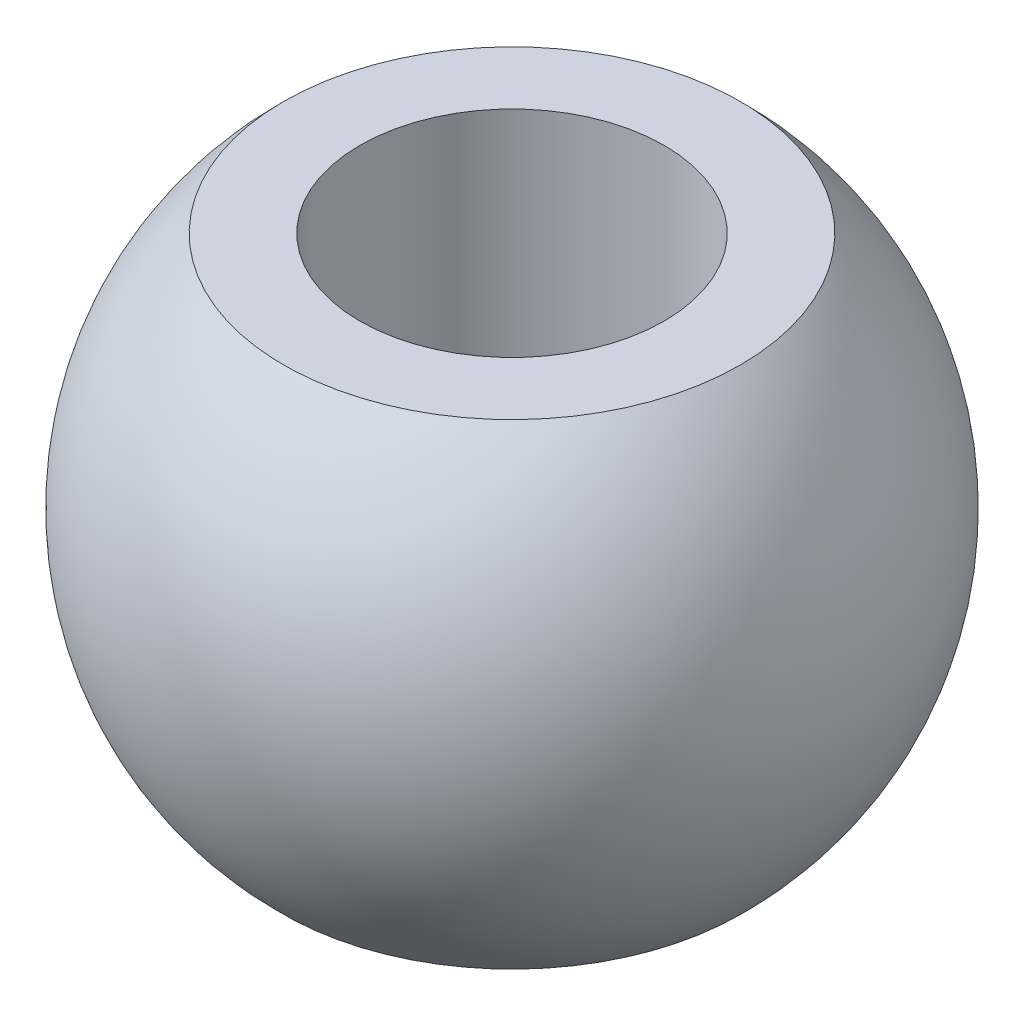
ISO-10303-21;
HEADER;
FILE_DESCRIPTION(('STEP AP214'),'2;1');
FILE_NAME('part.step','',(''),(''),'','','');
FILE_SCHEMA(('AUTOMOTIVE_DESIGN { 1 0 10303 214 1 1 1 1 }'));
ENDSEC;
DATA;
#1=APPLICATION_CONTEXT('core data for automotive mechanical design processes');
#2=APPLICATION_PROTOCOL_DEFINITION('international standard','automotive_design',2000,#1);
#3=PRODUCT_CONTEXT('',#1,'mechanical');
#4=PRODUCT('Part','Part','',(#3));
#5=PRODUCT_RELATED_PRODUCT_CATEGORY('part','',(#4));
#6=PRODUCT_DEFINITION_FORMATION('','',#4);
#7=PRODUCT_DEFINITION_CONTEXT('part definition',#1,'design');
#8=PRODUCT_DEFINITION('design','',#6,#7);
#9=PRODUCT_DEFINITION_SHAPE('','',#8);
#10=(LENGTH_UNIT() NAMED_UNIT(*) SI_UNIT(.MILLI.,.METRE.));
#11=(NAMED_UNIT(*) PLANE_ANGLE_UNIT() SI_UNIT($,.RADIAN.));
#12=(NAMED_UNIT(*) SI_UNIT($,.STERADIAN.) SOLID_ANGLE_UNIT());
#13=UNCERTAINTY_MEASURE_WITH_UNIT(LENGTH_MEASURE(1.E-05),#10,'distance_accuracy_value','');
#14=(GEOMETRIC_REPRESENTATION_CONTEXT(3) GLOBAL_UNCERTAINTY_ASSIGNED_CONTEXT((#13)) GLOBAL_UNIT_ASSIGNED_CONTEXT((#10,
#11,#12)) REPRESENTATION_CONTEXT('',''));
#15=CARTESIAN_POINT('',(0.,0.,0.));
#16=DIRECTION('',(0.,0.,1.));
#17=DIRECTION('',(1.,0.,0.));
#18=AXIS2_PLACEMENT_3D('',#15,#16,#17);
#19=CARTESIAN_POINT('',(0.,0.,0.));
#20=DIRECTION('',(0.,1.,0.));
#21=DIRECTION('',(1.,0.,0.));
#22=AXIS2_PLACEMENT_3D('',#19,#20,#21);
#23=SPHERICAL_SURFACE('',#22,6.5);
#24=CARTESIAN_POINT('',(0.,4.69041575982343,0.));
#25=DIRECTION('',(0.,1.,0.));
#26=DIRECTION('',(-1.,0.,0.));
#27=AXIS2_PLACEMENT_3D('',#24,#25,#26);
#28=CIRCLE('',#27,4.5);
#29=CARTESIAN_POINT('',(4.5,4.69041575982343,0.));
#30=VERTEX_POINT('',#29);
#31=EDGE_CURVE('E10',#30,#30,#28,.T.);
#32=CARTESIAN_POINT('',(0.,-4.69041575982343,0.));
#33=DIRECTION('',(0.,1.,0.));
#34=DIRECTION('',(-1.,0.,0.));
#35=AXIS2_PLACEMENT_3D('',#32,#33,#34);
#36=CIRCLE('',#35,4.5);
#37=CARTESIAN_POINT('',(4.5,-4.69041575982343,0.));
#38=VERTEX_POINT('',#37);
#39=EDGE_CURVE('E38',#38,#38,#36,.T.);
#40=CARTESIAN_POINT('',(4.5,4.69041575982343,0.));
#41=CARTESIAN_POINT('',(4.57877287374442,4.6148442802226,0.));
#42=CARTESIAN_POINT('',(4.65563841536448,4.53728507630973,0.));
#43=CARTESIAN_POINT('',(4.8053677727745,4.37839559921896,0.));
#44=CARTESIAN_POINT('',(4.87823158856444,4.29706532604106,0.));
#45=CARTESIAN_POINT('',(5.01977043273279,4.13083808977927,0.));
#46=CARTESIAN_POINT('',(5.08844546111119,4.04594112669538,0.));
#47=CARTESIAN_POINT('',(5.22143302047786,3.87279650596218,0.));
#48=CARTESIAN_POINT('',(5.28574555146612,3.78454884831288,0.));
#49=CARTESIAN_POINT('',(5.40984474817389,3.60492665014075,0.));
#50=CARTESIAN_POINT('',(5.46963141389341,3.51355210961792,0.));
#51=CARTESIAN_POINT('',(5.58452719340172,3.32790807697698,0.));
#52=CARTESIAN_POINT('',(5.63963630719051,3.23363858485886,0.));
#53=CARTESIAN_POINT('',(5.74503711462204,3.04244387784626,0.));
#54=CARTESIAN_POINT('',(5.79532880826477,2.94551866295179,0.));
#55=CARTESIAN_POINT('',(5.89096714697357,2.74925849217728,0.));
#56=CARTESIAN_POINT('',(5.93631379203963,2.64992353629725,0.));
#57=CARTESIAN_POINT('',(6.02194695106177,2.44909597729554,0.));
#58=CARTESIAN_POINT('',(6.06223346501784,2.34760337417386,0.));
#59=CARTESIAN_POINT('',(6.13764412200868,2.14271809110767,0.));
#60=CARTESIAN_POINT('',(6.17276826504345,2.03932541116316,0.));
#61=CARTESIAN_POINT('',(6.23776504129194,1.83090236667368,0.));
#62=CARTESIAN_POINT('',(6.26763767450565,1.72587200212871,0.));
#63=CARTESIAN_POINT('',(6.3220556196847,1.51444013688173,0.));
#64=CARTESIAN_POINT('',(6.34660093165003,1.40803863617971,0.));
#65=CARTESIAN_POINT('',(6.39030194268167,1.1941345267441,0.));
#66=CARTESIAN_POINT('',(6.40945764174797,1.0866319180105,0.));
#67=CARTESIAN_POINT('',(6.44233081321735,0.870798415058846,0.));
#68=CARTESIAN_POINT('',(6.45604828562042,0.762467520840801,0.));
#69=CARTESIAN_POINT('',(6.47801019125203,0.545252371507695,0.));
#70=CARTESIAN_POINT('',(6.48625462448058,0.436368116392635,0.));
#71=CARTESIAN_POINT('',(6.49724952885456,0.21832257418505,0.));
#72=CARTESIAN_POINT('',(6.5,0.109161287092525,0.));
#73=CARTESIAN_POINT('',(6.5,-0.109161287092525,0.));
#74=CARTESIAN_POINT('',(6.49724952885456,-0.21832257418505,0.));
#75=CARTESIAN_POINT('',(6.48625462448058,-0.436368116392634,0.));
#76=CARTESIAN_POINT('',(6.47801019125203,-0.545252371507694,0.));
#77=CARTESIAN_POINT('',(6.45604828562042,-0.7624675208408,0.));
#78=CARTESIAN_POINT('',(6.44233081321735,-0.870798415058846,0.));
#79=CARTESIAN_POINT('',(6.40945764174797,-1.08663191801049,0.));
#80=CARTESIAN_POINT('',(6.39030194268167,-1.1941345267441,0.));
#81=CARTESIAN_POINT('',(6.34660093165003,-1.40803863617971,0.));
#82=CARTESIAN_POINT('',(6.3220556196847,-1.51444013688172,0.));
#83=CARTESIAN_POINT('',(6.26763767450565,-1.72587200212871,0.));
#84=CARTESIAN_POINT('',(6.23776504129194,-1.83090236667368,0.));
#85=CARTESIAN_POINT('',(6.17276826504345,-2.03932541116316,0.));
#86=CARTESIAN_POINT('',(6.13764412200868,-2.14271809110767,0.));
#87=CARTESIAN_POINT('',(6.06223346501784,-2.34760337417385,0.));
#88=CARTESIAN_POINT('',(6.02194695106177,-2.44909597729553,0.));
#89=CARTESIAN_POINT('',(5.93631379203963,-2.64992353629725,0.));
#90=CARTESIAN_POINT('',(5.89096714697357,-2.74925849217728,0.));
#91=CARTESIAN_POINT('',(5.79532880826477,-2.94551866295179,0.));
#92=CARTESIAN_POINT('',(5.74503711462204,-3.04244387784626,0.));
#93=CARTESIAN_POINT('',(5.63963630719051,-3.23363858485886,0.));
#94=CARTESIAN_POINT('',(5.58452719340172,-3.32790807697698,0.));
#95=CARTESIAN_POINT('',(5.46963141389341,-3.51355210961792,0.));
#96=CARTESIAN_POINT('',(5.40984474817389,-3.60492665014075,0.));
#97=CARTESIAN_POINT('',(5.28574555146612,-3.78454884831288,0.));
#98=CARTESIAN_POINT('',(5.22143302047786,-3.87279650596218,0.));
#99=CARTESIAN_POINT('',(5.08844546111119,-4.04594112669538,0.));
#100=CARTESIAN_POINT('',(5.01977043273279,-4.13083808977927,0.));
#101=CARTESIAN_POINT('',(4.87823158856444,-4.29706532604106,0.));
#102=CARTESIAN_POINT('',(4.8053677727745,-4.37839559921896,0.));
#103=CARTESIAN_POINT('',(4.65563841536448,-4.53728507630973,0.));
#104=CARTESIAN_POINT('',(4.57877287374442,-4.6148442802226,0.));
#105=CARTESIAN_POINT('',(4.5,-4.69041575982343,0.));
#106=B_SPLINE_CURVE_WITH_KNOTS('',3,(#40,#41,#42,#43,#44,#45,#46,#47,#48,#49,#50,#51,#52,#53,
#54,#55,#56,#57,#58,#59,#60,#61,#62,#63,#64,#65,#66,#67,#68,#69,#70,#71,#72,#73,#74,#75,#76,#77,
#78,#79,#80,#81,#82,#83,#84,#85,#86,#87,#88,#89,#90,#91,#92,#93,#94,#95,#96,#97,#98,#99,#100,
#101,#102,#103,#104,#105),.UNSPECIFIED.,.F.,.F.,(4,2,2,2,2,2,2,2,2,2,2,2,2,2,2,2,2,2,2,2,2,2,2,
2,2,2,2,2,2,2,2,2,4),(0.,0.327449237778268,0.654898475556536,0.982347713334804,1.30979695111307,
1.63724618889134,1.96469542666961,2.29214466444788,2.61959390222615,2.94704314000441,
3.27449237778268,3.60194161556095,3.92939085333922,4.25684009111749,4.58428932889576,
4.91173856667402,5.23918780445229,5.56663704223056,5.89408628000883,6.2215355177871,
6.54898475556537,6.87643399334363,7.2038832311219,7.53133246890017,7.85878170667844,
8.18623094445671,8.51368018223497,8.84112942001324,9.16857865779151,9.49602789556978,
9.82347713334804,10.1509263711263,10.4783756089046),.UNSPECIFIED.);
#107=EDGE_CURVE('BSEAM32',#30,#38,#106,.T.);
#108=ORIENTED_EDGE('',*,*,#31,.F.);
#109=ORIENTED_EDGE('',*,*,#39,.T.);
#110=ORIENTED_EDGE('',*,*,#107,.T.);
#111=ORIENTED_EDGE('',*,*,#107,.F.);
#112=EDGE_LOOP('',(#108,#110,#109,#111));
#113=FACE_BOUND('',#112,.T.);
#114=ADVANCED_FACE('F32',(#113),#23,.T.);
#115=CARTESIAN_POINT('',(0.,4.69041575982343,0.));
#116=DIRECTION('',(0.,-1.,0.));
#117=DIRECTION('',(1.,0.,0.));
#118=AXIS2_PLACEMENT_3D('',#115,#116,#117);
#119=PLANE('',#118);
#120=CARTESIAN_POINT('',(0.,4.69041575982343,0.));
#121=DIRECTION('',(0.,1.,0.));
#122=DIRECTION('',(-1.,0.,0.));
#123=AXIS2_PLACEMENT_3D('',#120,#121,#122);
#124=CIRCLE('',#123,3.);
#125=CARTESIAN_POINT('',(-3.,4.69041575982343,0.));
#126=VERTEX_POINT('',#125);
#127=EDGE_CURVE('E46',#126,#126,#124,.T.);
#128=ORIENTED_EDGE('',*,*,#127,.F.);
#129=EDGE_LOOP('',(#128));
#130=FACE_BOUND('',#129,.T.);
#131=ORIENTED_EDGE('',*,*,#31,.T.);
#132=EDGE_LOOP('',(#131));
#133=FACE_BOUND('',#132,.T.);
#134=ADVANCED_FACE('F54',(#130,#133),#119,.F.);
#135=CARTESIAN_POINT('',(0.,-4.69041575982343,0.));
#136=DIRECTION('',(0.,1.,0.));
#137=DIRECTION('',(-1.,0.,0.));
#138=AXIS2_PLACEMENT_3D('',#135,#136,#137);
#139=PLANE('',#138);
#140=CARTESIAN_POINT('',(0.,-4.69041575982343,0.));
#141=DIRECTION('',(0.,1.,0.));
#142=DIRECTION('',(-1.,0.,0.));
#143=AXIS2_PLACEMENT_3D('',#140,#141,#142);
#144=CIRCLE('',#143,3.);
#145=CARTESIAN_POINT('',(-3.,-4.69041575982343,0.));
#146=VERTEX_POINT('',#145);
#147=EDGE_CURVE('E42',#146,#146,#144,.T.);
#148=ORIENTED_EDGE('',*,*,#147,.T.);
#149=EDGE_LOOP('',(#148));
#150=FACE_BOUND('',#149,.T.);
#151=ORIENTED_EDGE('',*,*,#39,.F.);
#152=EDGE_LOOP('',(#151));
#153=FACE_BOUND('',#152,.T.);
#154=ADVANCED_FACE('F56',(#150,#153),#139,.F.);
#155=CARTESIAN_POINT('',(0.,-4.69041575982343,0.));
#156=DIRECTION('',(0.,1.,0.));
#157=DIRECTION('',(-1.,0.,0.));
#158=AXIS2_PLACEMENT_3D('',#155,#156,#157);
#159=CYLINDRICAL_SURFACE('',#158,3.);
#160=ORIENTED_EDGE('',*,*,#147,.F.);
#161=EDGE_LOOP('',(#160));
#162=FACE_BOUND('',#161,.T.);
#163=ORIENTED_EDGE('',*,*,#127,.T.);
#164=EDGE_LOOP('',(#163));
#165=FACE_BOUND('',#164,.T.);
#166=ADVANCED_FACE('F52',(#162,#165),#159,.F.);
#167=CLOSED_SHELL('',(#114,#134,#154,#166));
#168=MANIFOLD_SOLID_BREP('B2',#167);
#169=ADVANCED_BREP_SHAPE_REPRESENTATION('',(#18,#168),#14);
#170=SHAPE_DEFINITION_REPRESENTATION(#9,#169);
ENDSEC;
END-ISO-10303-21;
